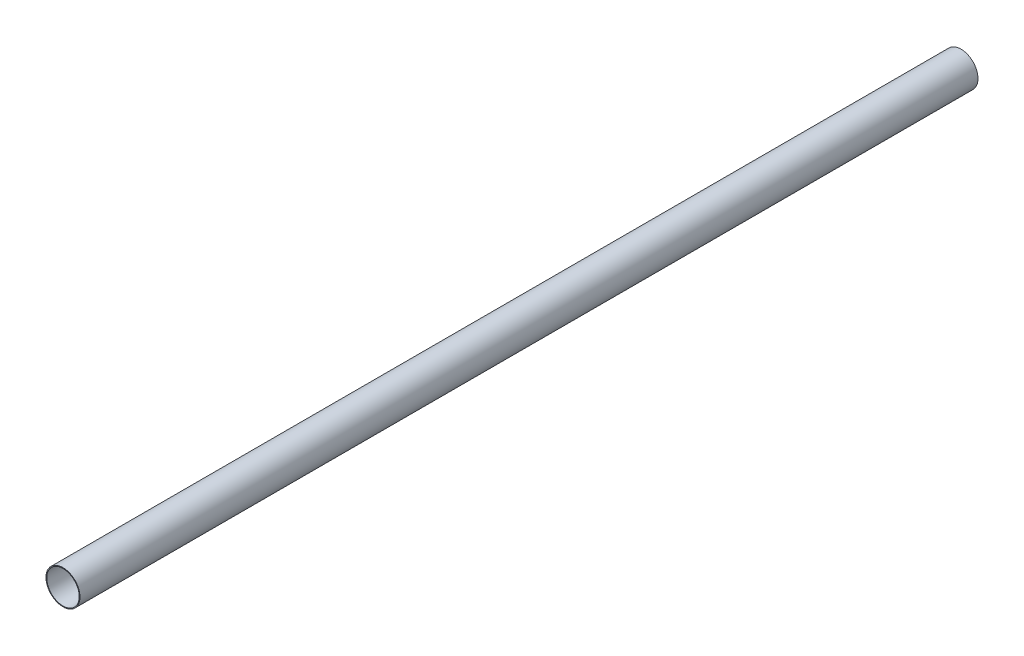
ISO-10303-21;
HEADER;
FILE_DESCRIPTION(('STEP AP214'),'2;1');
FILE_NAME('part.step','',(''),(''),'','','');
FILE_SCHEMA(('AUTOMOTIVE_DESIGN { 1 0 10303 214 1 1 1 1 }'));
ENDSEC;
DATA;
#1=APPLICATION_CONTEXT('core data for automotive mechanical design processes');
#2=APPLICATION_PROTOCOL_DEFINITION('international standard','automotive_design',2000,#1);
#3=PRODUCT_CONTEXT('',#1,'mechanical');
#4=PRODUCT('Part','Part','',(#3));
#5=PRODUCT_RELATED_PRODUCT_CATEGORY('part','',(#4));
#6=PRODUCT_DEFINITION_FORMATION('','',#4);
#7=PRODUCT_DEFINITION_CONTEXT('part definition',#1,'design');
#8=PRODUCT_DEFINITION('design','',#6,#7);
#9=PRODUCT_DEFINITION_SHAPE('','',#8);
#10=(LENGTH_UNIT() NAMED_UNIT(*) SI_UNIT(.MILLI.,.METRE.));
#11=(NAMED_UNIT(*) PLANE_ANGLE_UNIT() SI_UNIT($,.RADIAN.));
#12=(NAMED_UNIT(*) SI_UNIT($,.STERADIAN.) SOLID_ANGLE_UNIT());
#13=UNCERTAINTY_MEASURE_WITH_UNIT(LENGTH_MEASURE(1.E-05),#10,'distance_accuracy_value','');
#14=(GEOMETRIC_REPRESENTATION_CONTEXT(3) GLOBAL_UNCERTAINTY_ASSIGNED_CONTEXT((#13)) GLOBAL_UNIT_ASSIGNED_CONTEXT((#10,
#11,#12)) REPRESENTATION_CONTEXT('',''));
#15=CARTESIAN_POINT('',(0.,0.,0.));
#16=DIRECTION('',(0.,0.,1.));
#17=DIRECTION('',(1.,0.,0.));
#18=AXIS2_PLACEMENT_3D('',#15,#16,#17);
#19=CARTESIAN_POINT('',(0.,0.,83.82));
#20=DIRECTION('',(0.,0.,1.));
#21=DIRECTION('',(1.,0.,0.));
#22=AXIS2_PLACEMENT_3D('',#19,#20,#21);
#23=PLANE('',#22);
#24=CARTESIAN_POINT('',(0.,0.,83.82));
#25=DIRECTION('',(0.,0.,1.));
#26=DIRECTION('',(1.,0.,0.));
#27=AXIS2_PLACEMENT_3D('',#24,#25,#26);
#28=CIRCLE('',#27,1.5875);
#29=CARTESIAN_POINT('',(1.5875,0.,83.82));
#30=VERTEX_POINT('',#29);
#31=EDGE_CURVE('E10',#30,#30,#28,.T.);
#32=ORIENTED_EDGE('',*,*,#31,.T.);
#33=EDGE_LOOP('',(#32));
#34=FACE_BOUND('',#33,.T.);
#35=CARTESIAN_POINT('',(0.,0.,83.82));
#36=DIRECTION('',(0.,0.,1.));
#37=DIRECTION('',(1.,0.,0.));
#38=AXIS2_PLACEMENT_3D('',#35,#36,#37);
#39=CIRCLE('',#38,1.51584685281562);
#40=CARTESIAN_POINT('',(1.51584685281562,0.,83.82));
#41=VERTEX_POINT('',#40);
#42=EDGE_CURVE('E52',#41,#41,#39,.T.);
#43=ORIENTED_EDGE('',*,*,#42,.F.);
#44=EDGE_LOOP('',(#43));
#45=FACE_BOUND('',#44,.T.);
#46=ADVANCED_FACE('F39',(#34,#45),#23,.T.);
#47=CARTESIAN_POINT('',(0.,0.,0.));
#48=DIRECTION('',(0.,0.,1.));
#49=DIRECTION('',(1.,0.,0.));
#50=AXIS2_PLACEMENT_3D('',#47,#48,#49);
#51=PLANE('',#50);
#52=CARTESIAN_POINT('',(0.,0.,0.));
#53=DIRECTION('',(0.,0.,1.));
#54=DIRECTION('',(1.,0.,0.));
#55=AXIS2_PLACEMENT_3D('',#52,#53,#54);
#56=CIRCLE('',#55,1.5875);
#57=CARTESIAN_POINT('',(1.5875,0.,0.));
#58=VERTEX_POINT('',#57);
#59=EDGE_CURVE('E43',#58,#58,#56,.T.);
#60=ORIENTED_EDGE('',*,*,#59,.F.);
#61=EDGE_LOOP('',(#60));
#62=FACE_BOUND('',#61,.T.);
#63=CARTESIAN_POINT('',(0.,0.,0.));
#64=DIRECTION('',(0.,0.,1.));
#65=DIRECTION('',(1.,0.,0.));
#66=AXIS2_PLACEMENT_3D('',#63,#64,#65);
#67=CIRCLE('',#66,1.51584685281562);
#68=CARTESIAN_POINT('',(1.51584685281562,0.,0.));
#69=VERTEX_POINT('',#68);
#70=EDGE_CURVE('E54',#69,#69,#67,.T.);
#71=ORIENTED_EDGE('',*,*,#70,.T.);
#72=EDGE_LOOP('',(#71));
#73=FACE_BOUND('',#72,.T.);
#74=ADVANCED_FACE('F66',(#62,#73),#51,.F.);
#75=CARTESIAN_POINT('',(0.,0.,83.82));
#76=DIRECTION('',(0.,0.,-1.));
#77=DIRECTION('',(-1.,0.,0.));
#78=AXIS2_PLACEMENT_3D('',#75,#76,#77);
#79=CYLINDRICAL_SURFACE('',#78,1.5875);
#80=ORIENTED_EDGE('',*,*,#31,.F.);
#81=EDGE_LOOP('',(#80));
#82=FACE_BOUND('',#81,.T.);
#83=ORIENTED_EDGE('',*,*,#59,.T.);
#84=EDGE_LOOP('',(#83));
#85=FACE_BOUND('',#84,.T.);
#86=ADVANCED_FACE('F41',(#82,#85),#79,.T.);
#87=CARTESIAN_POINT('',(0.,0.,83.82));
#88=DIRECTION('',(0.,0.,-1.));
#89=DIRECTION('',(-1.,0.,0.));
#90=AXIS2_PLACEMENT_3D('',#87,#88,#89);
#91=CYLINDRICAL_SURFACE('',#90,1.51584685281562);
#92=ORIENTED_EDGE('',*,*,#42,.T.);
#93=EDGE_LOOP('',(#92));
#94=FACE_BOUND('',#93,.T.);
#95=ORIENTED_EDGE('',*,*,#70,.F.);
#96=EDGE_LOOP('',(#95));
#97=FACE_BOUND('',#96,.T.);
#98=ADVANCED_FACE('F62',(#94,#97),#91,.F.);
#99=CLOSED_SHELL('',(#46,#74,#86,#98));
#100=MANIFOLD_SOLID_BREP('B2',#99);
#101=ADVANCED_BREP_SHAPE_REPRESENTATION('',(#18,#100),#14);
#102=SHAPE_DEFINITION_REPRESENTATION(#9,#101);
ENDSEC;
END-ISO-10303-21;
